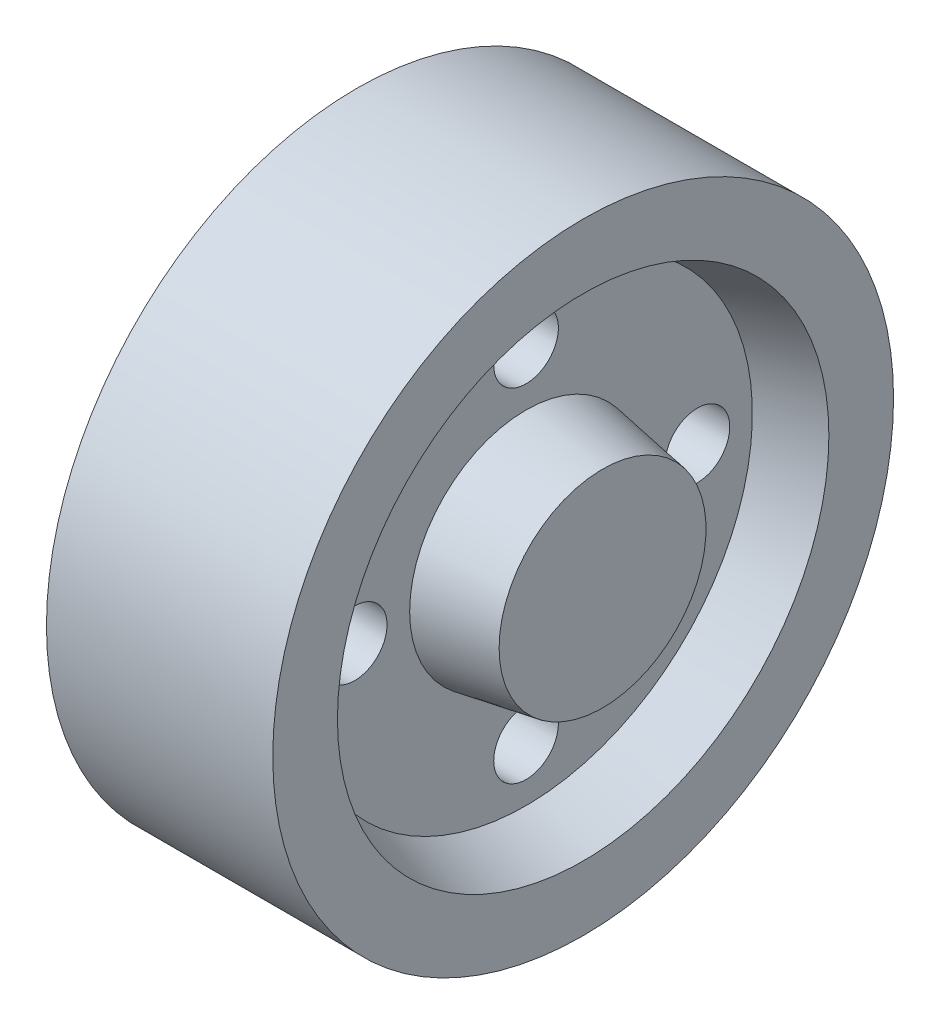
ISO-10303-21;
HEADER;
FILE_DESCRIPTION(('STEP AP214'),'2;1');
FILE_NAME('part.step','',(''),(''),'','','');
FILE_SCHEMA(('AUTOMOTIVE_DESIGN { 1 0 10303 214 1 1 1 1 }'));
ENDSEC;
DATA;
#1=APPLICATION_CONTEXT('core data for automotive mechanical design processes');
#2=APPLICATION_PROTOCOL_DEFINITION('international standard','automotive_design',2000,#1);
#3=PRODUCT_CONTEXT('',#1,'mechanical');
#4=PRODUCT('Part','Part','',(#3));
#5=PRODUCT_RELATED_PRODUCT_CATEGORY('part','',(#4));
#6=PRODUCT_DEFINITION_FORMATION('','',#4);
#7=PRODUCT_DEFINITION_CONTEXT('part definition',#1,'design');
#8=PRODUCT_DEFINITION('design','',#6,#7);
#9=PRODUCT_DEFINITION_SHAPE('','',#8);
#10=(LENGTH_UNIT() NAMED_UNIT(*) SI_UNIT(.MILLI.,.METRE.));
#11=(NAMED_UNIT(*) PLANE_ANGLE_UNIT() SI_UNIT($,.RADIAN.));
#12=(NAMED_UNIT(*) SI_UNIT($,.STERADIAN.) SOLID_ANGLE_UNIT());
#13=UNCERTAINTY_MEASURE_WITH_UNIT(LENGTH_MEASURE(1.E-05),#10,'distance_accuracy_value','');
#14=(GEOMETRIC_REPRESENTATION_CONTEXT(3) GLOBAL_UNCERTAINTY_ASSIGNED_CONTEXT((#13)) GLOBAL_UNIT_ASSIGNED_CONTEXT((#10,
#11,#12)) REPRESENTATION_CONTEXT('',''));
#15=CARTESIAN_POINT('',(0.,0.,0.));
#16=DIRECTION('',(0.,0.,1.));
#17=DIRECTION('',(1.,0.,0.));
#18=AXIS2_PLACEMENT_3D('',#15,#16,#17);
#19=CARTESIAN_POINT('',(20.5,0.,0.));
#20=DIRECTION('',(-1.,0.,0.));
#21=DIRECTION('',(0.,0.,1.));
#22=AXIS2_PLACEMENT_3D('',#19,#20,#21);
#23=PLANE('',#22);
#24=CARTESIAN_POINT('',(20.5,0.,0.));
#25=DIRECTION('',(-1.,0.,0.));
#26=DIRECTION('',(0.,0.,1.));
#27=AXIS2_PLACEMENT_3D('',#24,#25,#26);
#28=CIRCLE('',#27,16.);
#29=CARTESIAN_POINT('',(20.5,0.,16.));
#30=VERTEX_POINT('',#29);
#31=EDGE_CURVE('E10',#30,#30,#28,.T.);
#32=ORIENTED_EDGE('',*,*,#31,.F.);
#33=EDGE_LOOP('',(#32));
#34=FACE_BOUND('',#33,.T.);
#35=ADVANCED_FACE('F38',(#34),#23,.F.);
#36=CARTESIAN_POINT('',(20.5,0.,0.));
#37=DIRECTION('',(-1.,0.,0.));
#38=DIRECTION('',(0.,0.,1.));
#39=AXIS2_PLACEMENT_3D('',#36,#37,#38);
#40=CONICAL_SURFACE('',#39,16.,0.167448079219689);
#41=CARTESIAN_POINT('',(8.66784043380076,0.,0.));
#42=DIRECTION('',(-1.,0.,0.));
#43=DIRECTION('',(0.,0.,1.));
#44=AXIS2_PLACEMENT_3D('',#41,#42,#43);
#45=CIRCLE('',#44,18.);
#46=CARTESIAN_POINT('',(8.66784043380076,0.,18.));
#47=VERTEX_POINT('',#46);
#48=EDGE_CURVE('E44',#47,#47,#45,.T.);
#49=ORIENTED_EDGE('',*,*,#48,.F.);
#50=EDGE_LOOP('',(#49));
#51=FACE_BOUND('',#50,.T.);
#52=ORIENTED_EDGE('',*,*,#31,.T.);
#53=EDGE_LOOP('',(#52));
#54=FACE_BOUND('',#53,.T.);
#55=ADVANCED_FACE('F156',(#51,#54),#40,.T.);
#56=CARTESIAN_POINT('',(8.66784043380076,18.,0.));
#57=DIRECTION('',(-1.,0.,0.));
#58=DIRECTION('',(0.,0.,1.));
#59=AXIS2_PLACEMENT_3D('',#56,#57,#58);
#60=PLANE('',#59);
#61=CARTESIAN_POINT('',(8.66784043380076,26.5,0.));
#62=DIRECTION('',(-1.,0.,0.));
#63=DIRECTION('',(0.,0.,1.));
#64=AXIS2_PLACEMENT_3D('',#61,#62,#63);
#65=CIRCLE('',#64,5.);
#66=CARTESIAN_POINT('',(8.66784043380076,26.5,5.));
#67=VERTEX_POINT('',#66);
#68=EDGE_CURVE('E75',#67,#67,#65,.T.);
#69=ORIENTED_EDGE('',*,*,#68,.T.);
#70=EDGE_LOOP('',(#69));
#71=FACE_BOUND('',#70,.T.);
#72=CARTESIAN_POINT('',(8.66784043380076,0.,-26.5));
#73=DIRECTION('',(-1.,0.,0.));
#74=DIRECTION('',(0.,0.,1.));
#75=AXIS2_PLACEMENT_3D('',#72,#73,#74);
#76=CIRCLE('',#75,5.);
#77=CARTESIAN_POINT('',(8.66784043380076,0.,-21.5));
#78=VERTEX_POINT('',#77);
#79=EDGE_CURVE('E78',#78,#78,#76,.T.);
#80=ORIENTED_EDGE('',*,*,#79,.T.);
#81=EDGE_LOOP('',(#80));
#82=FACE_BOUND('',#81,.T.);
#83=CARTESIAN_POINT('',(8.66784043380076,-26.5,0.));
#84=DIRECTION('',(-1.,0.,0.));
#85=DIRECTION('',(0.,0.,1.));
#86=AXIS2_PLACEMENT_3D('',#83,#84,#85);
#87=CIRCLE('',#86,5.);
#88=CARTESIAN_POINT('',(8.66784043380076,-26.5,5.));
#89=VERTEX_POINT('',#88);
#90=EDGE_CURVE('E81',#89,#89,#87,.T.);
#91=ORIENTED_EDGE('',*,*,#90,.T.);
#92=EDGE_LOOP('',(#91));
#93=FACE_BOUND('',#92,.T.);
#94=CARTESIAN_POINT('',(8.66784043380076,0.,26.5));
#95=DIRECTION('',(-1.,0.,0.));
#96=DIRECTION('',(0.,0.,1.));
#97=AXIS2_PLACEMENT_3D('',#94,#95,#96);
#98=CIRCLE('',#97,4.99999999999999);
#99=CARTESIAN_POINT('',(8.66784043380076,0.,31.5));
#100=VERTEX_POINT('',#99);
#101=EDGE_CURVE('E84',#100,#100,#98,.T.);
#102=ORIENTED_EDGE('',*,*,#101,.T.);
#103=EDGE_LOOP('',(#102));
#104=FACE_BOUND('',#103,.T.);
#105=CARTESIAN_POINT('',(8.66784043380076,0.,0.));
#106=DIRECTION('',(-1.,0.,0.));
#107=DIRECTION('',(0.,0.,1.));
#108=AXIS2_PLACEMENT_3D('',#105,#106,#107);
#109=CIRCLE('',#108,35.);
#110=CARTESIAN_POINT('',(8.66784043380076,0.,35.));
#111=VERTEX_POINT('',#110);
#112=EDGE_CURVE('E48',#111,#111,#109,.T.);
#113=ORIENTED_EDGE('',*,*,#112,.F.);
#114=EDGE_LOOP('',(#113));
#115=FACE_BOUND('',#114,.T.);
#116=ORIENTED_EDGE('',*,*,#48,.T.);
#117=EDGE_LOOP('',(#116));
#118=FACE_BOUND('',#117,.T.);
#119=ADVANCED_FACE('F151',(#71,#82,#93,#104,#115,#118),#60,.F.);
#120=CARTESIAN_POINT('',(8.66784043380076,0.,0.));
#121=DIRECTION('',(1.,0.,0.));
#122=DIRECTION('',(0.,0.,-1.));
#123=AXIS2_PLACEMENT_3D('',#120,#121,#122);
#124=CONICAL_SURFACE('',#123,35.,0.32744067843122);
#125=CARTESIAN_POINT('',(17.5,0.,0.));
#126=DIRECTION('',(-1.,0.,0.));
#127=DIRECTION('',(0.,0.,1.));
#128=AXIS2_PLACEMENT_3D('',#125,#126,#127);
#129=CIRCLE('',#128,38.);
#130=CARTESIAN_POINT('',(17.5,0.,38.));
#131=VERTEX_POINT('',#130);
#132=EDGE_CURVE('E52',#131,#131,#129,.T.);
#133=ORIENTED_EDGE('',*,*,#132,.F.);
#134=EDGE_LOOP('',(#133));
#135=FACE_BOUND('',#134,.T.);
#136=ORIENTED_EDGE('',*,*,#112,.T.);
#137=EDGE_LOOP('',(#136));
#138=FACE_BOUND('',#137,.T.);
#139=ADVANCED_FACE('F145',(#135,#138),#124,.F.);
#140=CARTESIAN_POINT('',(17.5,38.,0.));
#141=DIRECTION('',(-1.,0.,0.));
#142=DIRECTION('',(0.,0.,1.));
#143=AXIS2_PLACEMENT_3D('',#140,#141,#142);
#144=PLANE('',#143);
#145=CARTESIAN_POINT('',(17.5,0.,0.));
#146=DIRECTION('',(-1.,0.,0.));
#147=DIRECTION('',(0.,0.,1.));
#148=AXIS2_PLACEMENT_3D('',#145,#146,#147);
#149=CIRCLE('',#148,48.);
#150=CARTESIAN_POINT('',(17.5,0.,48.));
#151=VERTEX_POINT('',#150);
#152=EDGE_CURVE('E57',#151,#151,#149,.T.);
#153=ORIENTED_EDGE('',*,*,#152,.F.);
#154=EDGE_LOOP('',(#153));
#155=FACE_BOUND('',#154,.T.);
#156=ORIENTED_EDGE('',*,*,#132,.T.);
#157=EDGE_LOOP('',(#156));
#158=FACE_BOUND('',#157,.T.);
#159=ADVANCED_FACE('F139',(#155,#158),#144,.F.);
#160=CARTESIAN_POINT('',(-20.5,0.,0.));
#161=DIRECTION('',(-1.,0.,0.));
#162=DIRECTION('',(0.,0.,1.));
#163=AXIS2_PLACEMENT_3D('',#160,#161,#162);
#164=CYLINDRICAL_SURFACE('',#163,48.);
#165=CARTESIAN_POINT('',(-17.5,0.,0.));
#166=DIRECTION('',(-1.,0.,0.));
#167=DIRECTION('',(0.,0.,1.));
#168=AXIS2_PLACEMENT_3D('',#165,#166,#167);
#169=CIRCLE('',#168,48.);
#170=CARTESIAN_POINT('',(-17.5,0.,48.));
#171=VERTEX_POINT('',#170);
#172=EDGE_CURVE('E60',#171,#171,#169,.T.);
#173=ORIENTED_EDGE('',*,*,#172,.F.);
#174=EDGE_LOOP('',(#173));
#175=FACE_BOUND('',#174,.T.);
#176=ORIENTED_EDGE('',*,*,#152,.T.);
#177=EDGE_LOOP('',(#176));
#178=FACE_BOUND('',#177,.T.);
#179=ADVANCED_FACE('F133',(#175,#178),#164,.T.);
#180=CARTESIAN_POINT('',(-17.5,38.,0.));
#181=DIRECTION('',(1.,0.,0.));
#182=DIRECTION('',(0.,0.,-1.));
#183=AXIS2_PLACEMENT_3D('',#180,#181,#182);
#184=PLANE('',#183);
#185=CARTESIAN_POINT('',(-17.5,0.,0.));
#186=DIRECTION('',(-1.,0.,0.));
#187=DIRECTION('',(0.,0.,1.));
#188=AXIS2_PLACEMENT_3D('',#185,#186,#187);
#189=CIRCLE('',#188,38.);
#190=CARTESIAN_POINT('',(-17.5,0.,38.));
#191=VERTEX_POINT('',#190);
#192=EDGE_CURVE('E63',#191,#191,#189,.T.);
#193=ORIENTED_EDGE('',*,*,#192,.F.);
#194=EDGE_LOOP('',(#193));
#195=FACE_BOUND('',#194,.T.);
#196=ORIENTED_EDGE('',*,*,#172,.T.);
#197=EDGE_LOOP('',(#196));
#198=FACE_BOUND('',#197,.T.);
#199=ADVANCED_FACE('F127',(#195,#198),#184,.F.);
#200=CARTESIAN_POINT('',(-17.5,0.,0.));
#201=DIRECTION('',(-1.,0.,0.));
#202=DIRECTION('',(0.,0.,1.));
#203=AXIS2_PLACEMENT_3D('',#200,#201,#202);
#204=CONICAL_SURFACE('',#203,38.,0.32744067843122);
#205=CARTESIAN_POINT('',(-8.66784043380076,0.,0.));
#206=DIRECTION('',(-1.,0.,0.));
#207=DIRECTION('',(0.,0.,1.));
#208=AXIS2_PLACEMENT_3D('',#205,#206,#207);
#209=CIRCLE('',#208,35.);
#210=CARTESIAN_POINT('',(-8.66784043380076,0.,35.));
#211=VERTEX_POINT('',#210);
#212=EDGE_CURVE('E66',#211,#211,#209,.T.);
#213=ORIENTED_EDGE('',*,*,#212,.F.);
#214=EDGE_LOOP('',(#213));
#215=FACE_BOUND('',#214,.T.);
#216=ORIENTED_EDGE('',*,*,#192,.T.);
#217=EDGE_LOOP('',(#216));
#218=FACE_BOUND('',#217,.T.);
#219=ADVANCED_FACE('F113',(#215,#218),#204,.F.);
#220=CARTESIAN_POINT('',(-8.66784043380076,18.,0.));
#221=DIRECTION('',(1.,0.,0.));
#222=DIRECTION('',(0.,0.,-1.));
#223=AXIS2_PLACEMENT_3D('',#220,#221,#222);
#224=PLANE('',#223);
#225=CARTESIAN_POINT('',(-8.66784043380076,26.5,0.));
#226=DIRECTION('',(-1.,0.,0.));
#227=DIRECTION('',(0.,0.,1.));
#228=AXIS2_PLACEMENT_3D('',#225,#226,#227);
#229=CIRCLE('',#228,5.);
#230=CARTESIAN_POINT('',(-8.66784043380076,26.5,5.));
#231=VERTEX_POINT('',#230);
#232=EDGE_CURVE('E87',#231,#231,#229,.T.);
#233=ORIENTED_EDGE('',*,*,#232,.F.);
#234=EDGE_LOOP('',(#233));
#235=FACE_BOUND('',#234,.T.);
#236=CARTESIAN_POINT('',(-8.66784043380076,0.,-26.5));
#237=DIRECTION('',(-1.,0.,0.));
#238=DIRECTION('',(0.,0.,1.));
#239=AXIS2_PLACEMENT_3D('',#236,#237,#238);
#240=CIRCLE('',#239,5.);
#241=CARTESIAN_POINT('',(-8.66784043380076,0.,-21.5));
#242=VERTEX_POINT('',#241);
#243=EDGE_CURVE('E98',#242,#242,#240,.T.);
#244=ORIENTED_EDGE('',*,*,#243,.F.);
#245=EDGE_LOOP('',(#244));
#246=FACE_BOUND('',#245,.T.);
#247=CARTESIAN_POINT('',(-8.66784043380076,-26.5,0.));
#248=DIRECTION('',(-1.,0.,0.));
#249=DIRECTION('',(0.,0.,1.));
#250=AXIS2_PLACEMENT_3D('',#247,#248,#249);
#251=CIRCLE('',#250,5.);
#252=CARTESIAN_POINT('',(-8.66784043380076,-26.5,5.));
#253=VERTEX_POINT('',#252);
#254=EDGE_CURVE('E92',#253,#253,#251,.T.);
#255=ORIENTED_EDGE('',*,*,#254,.F.);
#256=EDGE_LOOP('',(#255));
#257=FACE_BOUND('',#256,.T.);
#258=CARTESIAN_POINT('',(-8.66784043380076,0.,26.5));
#259=DIRECTION('',(-1.,0.,0.));
#260=DIRECTION('',(0.,0.,1.));
#261=AXIS2_PLACEMENT_3D('',#258,#259,#260);
#262=CIRCLE('',#261,4.99999999999999);
#263=CARTESIAN_POINT('',(-8.66784043380076,0.,31.5));
#264=VERTEX_POINT('',#263);
#265=EDGE_CURVE('E88',#264,#264,#262,.T.);
#266=ORIENTED_EDGE('',*,*,#265,.F.);
#267=EDGE_LOOP('',(#266));
#268=FACE_BOUND('',#267,.T.);
#269=CARTESIAN_POINT('',(-8.66784043380076,0.,0.));
#270=DIRECTION('',(-1.,0.,0.));
#271=DIRECTION('',(0.,0.,1.));
#272=AXIS2_PLACEMENT_3D('',#269,#270,#271);
#273=CIRCLE('',#272,18.);
#274=CARTESIAN_POINT('',(-8.66784043380076,0.,18.));
#275=VERTEX_POINT('',#274);
#276=EDGE_CURVE('E69',#275,#275,#273,.T.);
#277=ORIENTED_EDGE('',*,*,#276,.F.);
#278=EDGE_LOOP('',(#277));
#279=FACE_BOUND('',#278,.T.);
#280=ORIENTED_EDGE('',*,*,#212,.T.);
#281=EDGE_LOOP('',(#280));
#282=FACE_BOUND('',#281,.T.);
#283=ADVANCED_FACE('F109',(#235,#246,#257,#268,#279,#282),#224,.F.);
#284=CARTESIAN_POINT('',(-8.66784043380076,0.,0.));
#285=DIRECTION('',(1.,0.,0.));
#286=DIRECTION('',(0.,0.,-1.));
#287=AXIS2_PLACEMENT_3D('',#284,#285,#286);
#288=CONICAL_SURFACE('',#287,18.,0.167448079219689);
#289=CARTESIAN_POINT('',(-20.5,0.,0.));
#290=DIRECTION('',(-1.,0.,0.));
#291=DIRECTION('',(0.,0.,1.));
#292=AXIS2_PLACEMENT_3D('',#289,#290,#291);
#293=CIRCLE('',#292,16.);
#294=CARTESIAN_POINT('',(-20.5,0.,16.));
#295=VERTEX_POINT('',#294);
#296=EDGE_CURVE('E72',#295,#295,#293,.T.);
#297=ORIENTED_EDGE('',*,*,#296,.F.);
#298=EDGE_LOOP('',(#297));
#299=FACE_BOUND('',#298,.T.);
#300=ORIENTED_EDGE('',*,*,#276,.T.);
#301=EDGE_LOOP('',(#300));
#302=FACE_BOUND('',#301,.T.);
#303=ADVANCED_FACE('F112',(#299,#302),#288,.T.);
#304=CARTESIAN_POINT('',(-20.5,0.,0.));
#305=DIRECTION('',(1.,0.,0.));
#306=DIRECTION('',(0.,0.,-1.));
#307=AXIS2_PLACEMENT_3D('',#304,#305,#306);
#308=PLANE('',#307);
#309=ORIENTED_EDGE('',*,*,#296,.T.);
#310=EDGE_LOOP('',(#309));
#311=FACE_BOUND('',#310,.T.);
#312=ADVANCED_FACE('F206',(#311),#308,.F.);
#313=CARTESIAN_POINT('',(17.3321595661992,0.,26.5));
#314=DIRECTION('',(-1.,0.,0.));
#315=DIRECTION('',(0.,0.,1.));
#316=AXIS2_PLACEMENT_3D('',#313,#314,#315);
#317=CYLINDRICAL_SURFACE('',#316,4.99999999999999);
#318=ORIENTED_EDGE('',*,*,#265,.T.);
#319=EDGE_LOOP('',(#318));
#320=FACE_BOUND('',#319,.T.);
#321=ORIENTED_EDGE('',*,*,#101,.F.);
#322=EDGE_LOOP('',(#321));
#323=FACE_BOUND('',#322,.T.);
#324=ADVANCED_FACE('F214',(#320,#323),#317,.F.);
#325=CARTESIAN_POINT('',(17.3321595661992,-26.5,0.));
#326=DIRECTION('',(-1.,0.,0.));
#327=DIRECTION('',(0.,0.,1.));
#328=AXIS2_PLACEMENT_3D('',#325,#326,#327);
#329=CYLINDRICAL_SURFACE('',#328,5.);
#330=ORIENTED_EDGE('',*,*,#254,.T.);
#331=EDGE_LOOP('',(#330));
#332=FACE_BOUND('',#331,.T.);
#333=ORIENTED_EDGE('',*,*,#90,.F.);
#334=EDGE_LOOP('',(#333));
#335=FACE_BOUND('',#334,.T.);
#336=ADVANCED_FACE('F227',(#332,#335),#329,.F.);
#337=CARTESIAN_POINT('',(17.3321595661992,0.,-26.5));
#338=DIRECTION('',(-1.,0.,0.));
#339=DIRECTION('',(0.,0.,1.));
#340=AXIS2_PLACEMENT_3D('',#337,#338,#339);
#341=CYLINDRICAL_SURFACE('',#340,5.);
#342=ORIENTED_EDGE('',*,*,#243,.T.);
#343=EDGE_LOOP('',(#342));
#344=FACE_BOUND('',#343,.T.);
#345=ORIENTED_EDGE('',*,*,#79,.F.);
#346=EDGE_LOOP('',(#345));
#347=FACE_BOUND('',#346,.T.);
#348=ADVANCED_FACE('F237',(#344,#347),#341,.F.);
#349=CARTESIAN_POINT('',(17.3321595661992,26.5,0.));
#350=DIRECTION('',(-1.,0.,0.));
#351=DIRECTION('',(0.,0.,1.));
#352=AXIS2_PLACEMENT_3D('',#349,#350,#351);
#353=CYLINDRICAL_SURFACE('',#352,5.);
#354=ORIENTED_EDGE('',*,*,#232,.T.);
#355=EDGE_LOOP('',(#354));
#356=FACE_BOUND('',#355,.T.);
#357=ORIENTED_EDGE('',*,*,#68,.F.);
#358=EDGE_LOOP('',(#357));
#359=FACE_BOUND('',#358,.T.);
#360=ADVANCED_FACE('F106',(#356,#359),#353,.F.);
#361=CLOSED_SHELL('',(#35,#55,#119,#139,#159,#179,#199,#219,#283,#303,#312,#324,#336,#348,#360));
#362=CARTESIAN_POINT('',(17.3321595661992,0.,0.));
#363=DIRECTION('',(-1.,0.,0.));
#364=DIRECTION('',(0.,0.,1.));
#365=AXIS2_PLACEMENT_3D('',#362,#363,#364);
#366=CYLINDRICAL_SURFACE('',#365,10.);
#367=CARTESIAN_POINT('',(17.3321595661992,0.,0.));
#368=DIRECTION('',(-1.,0.,0.));
#369=DIRECTION('',(0.,0.,1.));
#370=AXIS2_PLACEMENT_3D('',#367,#368,#369);
#371=CIRCLE('',#370,10.);
#372=CARTESIAN_POINT('',(17.3321595661992,0.,10.));
#373=VERTEX_POINT('',#372);
#374=EDGE_CURVE('E91',#373,#373,#371,.T.);
#375=ORIENTED_EDGE('',*,*,#374,.F.);
#376=EDGE_LOOP('',(#375));
#377=FACE_BOUND('',#376,.T.);
#378=CARTESIAN_POINT('',(-8.66784043380076,0.,0.));
#379=DIRECTION('',(-1.,0.,0.));
#380=DIRECTION('',(0.,0.,1.));
#381=AXIS2_PLACEMENT_3D('',#378,#379,#380);
#382=CIRCLE('',#381,10.);
#383=CARTESIAN_POINT('',(-8.66784043380076,0.,10.));
#384=VERTEX_POINT('',#383);
#385=EDGE_CURVE('E95',#384,#384,#382,.T.);
#386=ORIENTED_EDGE('',*,*,#385,.T.);
#387=EDGE_LOOP('',(#386));
#388=FACE_BOUND('',#387,.T.);
#389=ADVANCED_FACE('F261',(#377,#388),#366,.F.);
#390=CARTESIAN_POINT('',(17.3321595661992,0.,0.));
#391=DIRECTION('',(-1.,0.,0.));
#392=DIRECTION('',(0.,0.,1.));
#393=AXIS2_PLACEMENT_3D('',#390,#391,#392);
#394=PLANE('',#393);
#395=ORIENTED_EDGE('',*,*,#374,.T.);
#396=EDGE_LOOP('',(#395));
#397=FACE_BOUND('',#396,.T.);
#398=ADVANCED_FACE('F265',(#397),#394,.T.);
#399=CARTESIAN_POINT('',(-8.66784043380076,0.,0.));
#400=DIRECTION('',(-1.,0.,0.));
#401=DIRECTION('',(0.,0.,1.));
#402=AXIS2_PLACEMENT_3D('',#399,#400,#401);
#403=PLANE('',#402);
#404=ORIENTED_EDGE('',*,*,#385,.F.);
#405=EDGE_LOOP('',(#404));
#406=FACE_BOUND('',#405,.T.);
#407=ADVANCED_FACE('F276',(#406),#403,.F.);
#408=CLOSED_SHELL('',(#389,#398,#407));
#409=ORIENTED_CLOSED_SHELL('',*,#408,.T.);
#410=BREP_WITH_VOIDS('B2',#361,(#409));
#411=ADVANCED_BREP_SHAPE_REPRESENTATION('',(#18,#410),#14);
#412=SHAPE_DEFINITION_REPRESENTATION(#9,#411);
ENDSEC;
END-ISO-10303-21;
